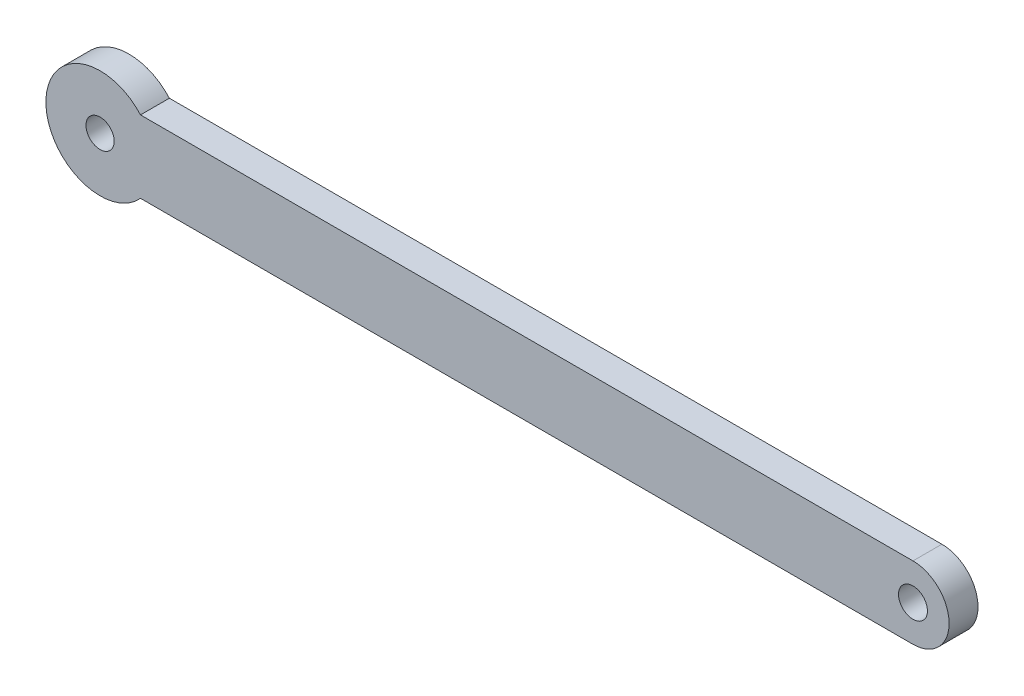
ISO-10303-21;
HEADER;
FILE_DESCRIPTION(('STEP AP214'),'2;1');
FILE_NAME('part.step','',(''),(''),'','','');
FILE_SCHEMA(('AUTOMOTIVE_DESIGN { 1 0 10303 214 1 1 1 1 }'));
ENDSEC;
DATA;
#1=APPLICATION_CONTEXT('core data for automotive mechanical design processes');
#2=APPLICATION_PROTOCOL_DEFINITION('international standard','automotive_design',2000,#1);
#3=PRODUCT_CONTEXT('',#1,'mechanical');
#4=PRODUCT('Part','Part','',(#3));
#5=PRODUCT_RELATED_PRODUCT_CATEGORY('part','',(#4));
#6=PRODUCT_DEFINITION_FORMATION('','',#4);
#7=PRODUCT_DEFINITION_CONTEXT('part definition',#1,'design');
#8=PRODUCT_DEFINITION('design','',#6,#7);
#9=PRODUCT_DEFINITION_SHAPE('','',#8);
#10=(LENGTH_UNIT() NAMED_UNIT(*) SI_UNIT(.MILLI.,.METRE.));
#11=(NAMED_UNIT(*) PLANE_ANGLE_UNIT() SI_UNIT($,.RADIAN.));
#12=(NAMED_UNIT(*) SI_UNIT($,.STERADIAN.) SOLID_ANGLE_UNIT());
#13=UNCERTAINTY_MEASURE_WITH_UNIT(LENGTH_MEASURE(1.E-05),#10,'distance_accuracy_value','');
#14=(GEOMETRIC_REPRESENTATION_CONTEXT(3) GLOBAL_UNCERTAINTY_ASSIGNED_CONTEXT((#13)) GLOBAL_UNIT_ASSIGNED_CONTEXT((#10,
#11,#12)) REPRESENTATION_CONTEXT('',''));
#15=CARTESIAN_POINT('',(0.,0.,0.));
#16=DIRECTION('',(0.,0.,1.));
#17=DIRECTION('',(1.,0.,0.));
#18=AXIS2_PLACEMENT_3D('',#15,#16,#17);
#19=CARTESIAN_POINT('',(0.,0.,2.));
#20=DIRECTION('',(0.,0.,1.));
#21=DIRECTION('',(1.,0.,0.));
#22=AXIS2_PLACEMENT_3D('',#19,#20,#21);
#23=PLANE('',#22);
#24=CARTESIAN_POINT('',(112.5,0.,2.));
#25=DIRECTION('',(0.,0.,1.));
#26=DIRECTION('',(1.,0.,0.));
#27=AXIS2_PLACEMENT_3D('',#24,#25,#26);
#28=CIRCLE('',#27,2.);
#29=CARTESIAN_POINT('',(114.5,0.,2.));
#30=VERTEX_POINT('',#29);
#31=EDGE_CURVE('E99',#30,#30,#28,.T.);
#32=ORIENTED_EDGE('',*,*,#31,.F.);
#33=EDGE_LOOP('',(#32));
#34=FACE_BOUND('',#33,.T.);
#35=CARTESIAN_POINT('',(0.,0.,2.));
#36=DIRECTION('',(0.,0.,1.));
#37=DIRECTION('',(1.,0.,0.));
#38=AXIS2_PLACEMENT_3D('',#35,#36,#37);
#39=CIRCLE('',#38,7.5);
#40=CARTESIAN_POINT('',(5.59016994374947,5.,2.));
#41=VERTEX_POINT('',#40);
#42=CARTESIAN_POINT('',(5.59016994374947,-5.,2.));
#43=VERTEX_POINT('',#42);
#44=EDGE_CURVE('E84',#41,#43,#39,.T.);
#45=ORIENTED_EDGE('',*,*,#44,.T.);
#46=DIRECTION('',(1.,0.,0.));
#47=VECTOR('',#46,1.);
#48=CARTESIAN_POINT('',(5.59016994374947,-5.,2.));
#49=LINE('',#48,#47);
#50=CARTESIAN_POINT('',(112.5,-5.,2.));
#51=VERTEX_POINT('',#50);
#52=EDGE_CURVE('E79',#43,#51,#49,.T.);
#53=ORIENTED_EDGE('',*,*,#52,.T.);
#54=CARTESIAN_POINT('',(112.5,0.,2.));
#55=DIRECTION('',(0.,0.,1.));
#56=DIRECTION('',(1.,0.,0.));
#57=AXIS2_PLACEMENT_3D('',#54,#55,#56);
#58=CIRCLE('',#57,5.);
#59=CARTESIAN_POINT('',(112.5,5.,2.));
#60=VERTEX_POINT('',#59);
#61=EDGE_CURVE('E82',#51,#60,#58,.T.);
#62=ORIENTED_EDGE('',*,*,#61,.T.);
#63=DIRECTION('',(-1.,0.,0.));
#64=VECTOR('',#63,1.);
#65=CARTESIAN_POINT('',(5.59016994374947,5.,2.));
#66=LINE('',#65,#64);
#67=EDGE_CURVE('E49',#60,#41,#66,.T.);
#68=ORIENTED_EDGE('',*,*,#67,.T.);
#69=EDGE_LOOP('',(#45,#53,#62,#68));
#70=FACE_BOUND('',#69,.T.);
#71=CARTESIAN_POINT('',(0.,0.,2.));
#72=DIRECTION('',(0.,0.,1.));
#73=DIRECTION('',(1.,0.,0.));
#74=AXIS2_PLACEMENT_3D('',#71,#72,#73);
#75=CIRCLE('',#74,1.95);
#76=CARTESIAN_POINT('',(1.95,0.,2.));
#77=VERTEX_POINT('',#76);
#78=EDGE_CURVE('E114',#77,#77,#75,.T.);
#79=ORIENTED_EDGE('',*,*,#78,.F.);
#80=EDGE_LOOP('',(#79));
#81=FACE_BOUND('',#80,.T.);
#82=ADVANCED_FACE('F32',(#34,#70,#81),#23,.T.);
#83=CARTESIAN_POINT('',(0.,0.,-2.));
#84=DIRECTION('',(0.,0.,1.));
#85=DIRECTION('',(1.,0.,0.));
#86=AXIS2_PLACEMENT_3D('',#83,#84,#85);
#87=PLANE('',#86);
#88=CARTESIAN_POINT('',(0.,0.,-2.));
#89=DIRECTION('',(0.,0.,1.));
#90=DIRECTION('',(1.,0.,0.));
#91=AXIS2_PLACEMENT_3D('',#88,#89,#90);
#92=CIRCLE('',#91,7.5);
#93=CARTESIAN_POINT('',(5.59016994374947,5.,-2.));
#94=VERTEX_POINT('',#93);
#95=CARTESIAN_POINT('',(5.59016994374947,-5.,-2.));
#96=VERTEX_POINT('',#95);
#97=EDGE_CURVE('E96',#94,#96,#92,.T.);
#98=ORIENTED_EDGE('',*,*,#97,.F.);
#99=DIRECTION('',(-1.,0.,0.));
#100=VECTOR('',#99,1.);
#101=CARTESIAN_POINT('',(5.59016994374947,5.,-2.));
#102=LINE('',#101,#100);
#103=CARTESIAN_POINT('',(112.5,5.,-2.));
#104=VERTEX_POINT('',#103);
#105=EDGE_CURVE('E72',#104,#94,#102,.T.);
#106=ORIENTED_EDGE('',*,*,#105,.F.);
#107=CARTESIAN_POINT('',(112.5,0.,-2.));
#108=DIRECTION('',(0.,0.,1.));
#109=DIRECTION('',(1.,0.,0.));
#110=AXIS2_PLACEMENT_3D('',#107,#108,#109);
#111=CIRCLE('',#110,5.);
#112=CARTESIAN_POINT('',(112.5,-5.,-2.));
#113=VERTEX_POINT('',#112);
#114=EDGE_CURVE('E66',#113,#104,#111,.T.);
#115=ORIENTED_EDGE('',*,*,#114,.F.);
#116=DIRECTION('',(1.,0.,0.));
#117=VECTOR('',#116,1.);
#118=CARTESIAN_POINT('',(5.59016994374947,-5.,-2.));
#119=LINE('',#118,#117);
#120=EDGE_CURVE('E88',#96,#113,#119,.T.);
#121=ORIENTED_EDGE('',*,*,#120,.F.);
#122=EDGE_LOOP('',(#98,#106,#115,#121));
#123=FACE_BOUND('',#122,.T.);
#124=CARTESIAN_POINT('',(112.5,0.,-2.));
#125=DIRECTION('',(0.,0.,1.));
#126=DIRECTION('',(1.,0.,0.));
#127=AXIS2_PLACEMENT_3D('',#124,#125,#126);
#128=CIRCLE('',#127,2.);
#129=CARTESIAN_POINT('',(114.5,0.,-2.));
#130=VERTEX_POINT('',#129);
#131=EDGE_CURVE('E111',#130,#130,#128,.T.);
#132=ORIENTED_EDGE('',*,*,#131,.T.);
#133=EDGE_LOOP('',(#132));
#134=FACE_BOUND('',#133,.T.);
#135=CARTESIAN_POINT('',(0.,0.,-2.));
#136=DIRECTION('',(0.,0.,1.));
#137=DIRECTION('',(1.,0.,0.));
#138=AXIS2_PLACEMENT_3D('',#135,#136,#137);
#139=CIRCLE('',#138,1.95);
#140=CARTESIAN_POINT('',(1.95,0.,-2.));
#141=VERTEX_POINT('',#140);
#142=EDGE_CURVE('E117',#141,#141,#139,.T.);
#143=ORIENTED_EDGE('',*,*,#142,.T.);
#144=EDGE_LOOP('',(#143));
#145=FACE_BOUND('',#144,.T.);
#146=ADVANCED_FACE('F107',(#123,#134,#145),#87,.F.);
#147=CARTESIAN_POINT('',(0.,0.,2.));
#148=DIRECTION('',(0.,0.,-1.));
#149=DIRECTION('',(-1.,0.,0.));
#150=AXIS2_PLACEMENT_3D('',#147,#148,#149);
#151=CYLINDRICAL_SURFACE('',#150,7.5);
#152=ORIENTED_EDGE('',*,*,#97,.T.);
#153=DIRECTION('',(0.,0.,-1.));
#154=VECTOR('',#153,1.);
#155=CARTESIAN_POINT('',(5.59016994374947,-5.,2.));
#156=LINE('',#155,#154);
#157=EDGE_CURVE('E11',#43,#96,#156,.T.);
#158=ORIENTED_EDGE('',*,*,#157,.F.);
#159=ORIENTED_EDGE('',*,*,#44,.F.);
#160=DIRECTION('',(0.,0.,-1.));
#161=VECTOR('',#160,1.);
#162=CARTESIAN_POINT('',(5.59016994374947,5.,2.));
#163=LINE('',#162,#161);
#164=EDGE_CURVE('E92',#41,#94,#163,.T.);
#165=ORIENTED_EDGE('',*,*,#164,.T.);
#166=EDGE_LOOP('',(#152,#158,#159,#165));
#167=FACE_BOUND('',#166,.T.);
#168=ADVANCED_FACE('F34',(#167),#151,.T.);
#169=CARTESIAN_POINT('',(5.59016994374947,-5.,2.));
#170=DIRECTION('',(0.,1.,0.));
#171=DIRECTION('',(0.,0.,1.));
#172=AXIS2_PLACEMENT_3D('',#169,#170,#171);
#173=PLANE('',#172);
#174=ORIENTED_EDGE('',*,*,#120,.T.);
#175=DIRECTION('',(0.,0.,-1.));
#176=VECTOR('',#175,1.);
#177=CARTESIAN_POINT('',(112.5,-5.,2.));
#178=LINE('',#177,#176);
#179=EDGE_CURVE('E41',#51,#113,#178,.T.);
#180=ORIENTED_EDGE('',*,*,#179,.F.);
#181=ORIENTED_EDGE('',*,*,#52,.F.);
#182=ORIENTED_EDGE('',*,*,#157,.T.);
#183=EDGE_LOOP('',(#174,#180,#181,#182));
#184=FACE_BOUND('',#183,.T.);
#185=ADVANCED_FACE('F87',(#184),#173,.F.);
#186=CARTESIAN_POINT('',(112.5,0.,2.));
#187=DIRECTION('',(0.,0.,-1.));
#188=DIRECTION('',(-1.,0.,0.));
#189=AXIS2_PLACEMENT_3D('',#186,#187,#188);
#190=CYLINDRICAL_SURFACE('',#189,5.);
#191=ORIENTED_EDGE('',*,*,#114,.T.);
#192=DIRECTION('',(0.,0.,-1.));
#193=VECTOR('',#192,1.);
#194=CARTESIAN_POINT('',(112.5,5.,2.));
#195=LINE('',#194,#193);
#196=EDGE_CURVE('E89',#60,#104,#195,.T.);
#197=ORIENTED_EDGE('',*,*,#196,.F.);
#198=ORIENTED_EDGE('',*,*,#61,.F.);
#199=ORIENTED_EDGE('',*,*,#179,.T.);
#200=EDGE_LOOP('',(#191,#197,#198,#199));
#201=FACE_BOUND('',#200,.T.);
#202=ADVANCED_FACE('F90',(#201),#190,.T.);
#203=CARTESIAN_POINT('',(5.59016994374947,5.,2.));
#204=DIRECTION('',(0.,-1.,0.));
#205=DIRECTION('',(0.,0.,-1.));
#206=AXIS2_PLACEMENT_3D('',#203,#204,#205);
#207=PLANE('',#206);
#208=ORIENTED_EDGE('',*,*,#105,.T.);
#209=ORIENTED_EDGE('',*,*,#164,.F.);
#210=ORIENTED_EDGE('',*,*,#67,.F.);
#211=ORIENTED_EDGE('',*,*,#196,.T.);
#212=EDGE_LOOP('',(#208,#209,#210,#211));
#213=FACE_BOUND('',#212,.T.);
#214=ADVANCED_FACE('F104',(#213),#207,.F.);
#215=CARTESIAN_POINT('',(112.5,0.,2.));
#216=DIRECTION('',(0.,0.,-1.));
#217=DIRECTION('',(-1.,0.,0.));
#218=AXIS2_PLACEMENT_3D('',#215,#216,#217);
#219=CYLINDRICAL_SURFACE('',#218,2.);
#220=ORIENTED_EDGE('',*,*,#31,.T.);
#221=EDGE_LOOP('',(#220));
#222=FACE_BOUND('',#221,.T.);
#223=ORIENTED_EDGE('',*,*,#131,.F.);
#224=EDGE_LOOP('',(#223));
#225=FACE_BOUND('',#224,.T.);
#226=ADVANCED_FACE('F134',(#222,#225),#219,.F.);
#227=CARTESIAN_POINT('',(0.,0.,2.));
#228=DIRECTION('',(0.,0.,-1.));
#229=DIRECTION('',(-1.,0.,0.));
#230=AXIS2_PLACEMENT_3D('',#227,#228,#229);
#231=CYLINDRICAL_SURFACE('',#230,1.95);
#232=ORIENTED_EDGE('',*,*,#78,.T.);
#233=EDGE_LOOP('',(#232));
#234=FACE_BOUND('',#233,.T.);
#235=ORIENTED_EDGE('',*,*,#142,.F.);
#236=EDGE_LOOP('',(#235));
#237=FACE_BOUND('',#236,.T.);
#238=ADVANCED_FACE('F123',(#234,#237),#231,.F.);
#239=CLOSED_SHELL('',(#82,#146,#168,#185,#202,#214,#226,#238));
#240=MANIFOLD_SOLID_BREP('B2',#239);
#241=ADVANCED_BREP_SHAPE_REPRESENTATION('',(#18,#240),#14);
#242=SHAPE_DEFINITION_REPRESENTATION(#9,#241);
ENDSEC;
END-ISO-10303-21;
